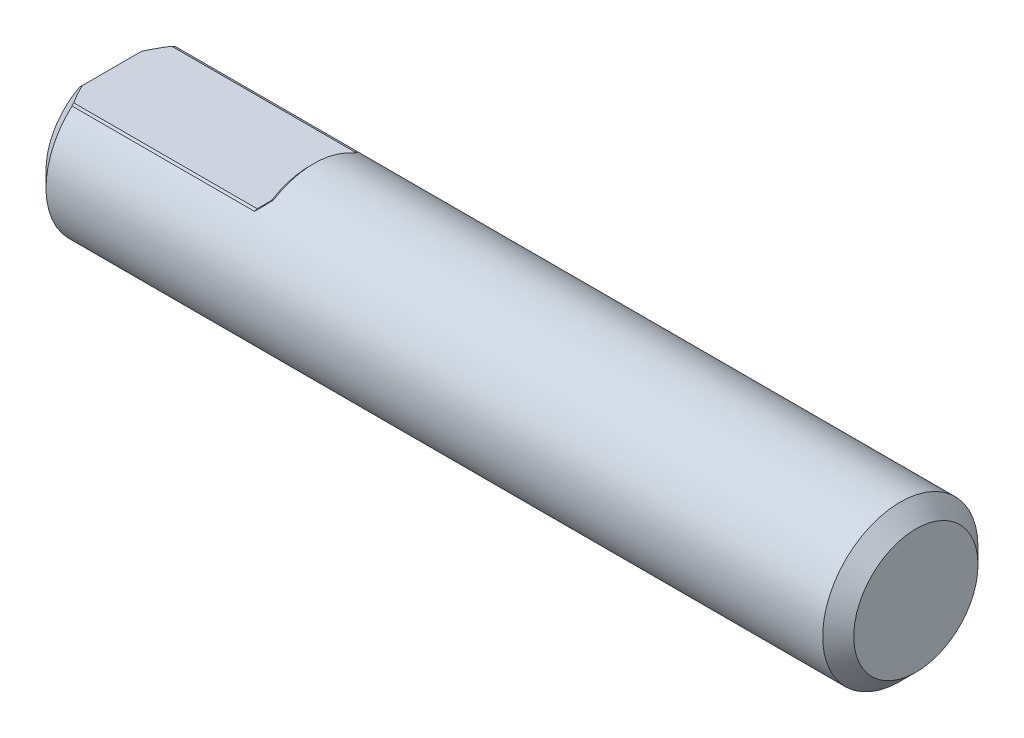
ISO-10303-21;
HEADER;
FILE_DESCRIPTION(('STEP AP214'),'2;1');
FILE_NAME('part.step','',(''),(''),'','','');
FILE_SCHEMA(('AUTOMOTIVE_DESIGN { 1 0 10303 214 1 1 1 1 }'));
ENDSEC;
DATA;
#1=APPLICATION_CONTEXT('core data for automotive mechanical design processes');
#2=APPLICATION_PROTOCOL_DEFINITION('international standard','automotive_design',2000,#1);
#3=PRODUCT_CONTEXT('',#1,'mechanical');
#4=PRODUCT('Part','Part','',(#3));
#5=PRODUCT_RELATED_PRODUCT_CATEGORY('part','',(#4));
#6=PRODUCT_DEFINITION_FORMATION('','',#4);
#7=PRODUCT_DEFINITION_CONTEXT('part definition',#1,'design');
#8=PRODUCT_DEFINITION('design','',#6,#7);
#9=PRODUCT_DEFINITION_SHAPE('','',#8);
#10=(LENGTH_UNIT() NAMED_UNIT(*) SI_UNIT(.MILLI.,.METRE.));
#11=(NAMED_UNIT(*) PLANE_ANGLE_UNIT() SI_UNIT($,.RADIAN.));
#12=(NAMED_UNIT(*) SI_UNIT($,.STERADIAN.) SOLID_ANGLE_UNIT());
#13=UNCERTAINTY_MEASURE_WITH_UNIT(LENGTH_MEASURE(1.E-05),#10,'distance_accuracy_value','');
#14=(GEOMETRIC_REPRESENTATION_CONTEXT(3) GLOBAL_UNCERTAINTY_ASSIGNED_CONTEXT((#13)) GLOBAL_UNIT_ASSIGNED_CONTEXT((#10,
#11,#12)) REPRESENTATION_CONTEXT('',''));
#15=CARTESIAN_POINT('',(0.,0.,0.));
#16=DIRECTION('',(0.,0.,1.));
#17=DIRECTION('',(1.,0.,0.));
#18=AXIS2_PLACEMENT_3D('',#15,#16,#17);
#19=CARTESIAN_POINT('',(-16.51,0.,0.));
#20=DIRECTION('',(1.,0.,0.));
#21=DIRECTION('',(0.,0.,-1.));
#22=AXIS2_PLACEMENT_3D('',#19,#20,#21);
#23=CYLINDRICAL_SURFACE('',#22,3.175);
#24=CARTESIAN_POINT('',(-8.09625,0.,0.));
#25=DIRECTION('',(1.,0.,0.));
#26=DIRECTION('',(0.,0.,-1.));
#27=AXIS2_PLACEMENT_3D('',#24,#25,#26);
#28=CIRCLE('',#27,3.175);
#29=CARTESIAN_POINT('',(-8.09625,2.70710526315788,-1.65897742425353));
#30=VERTEX_POINT('',#29);
#31=CARTESIAN_POINT('',(-8.09625,2.70710526315788,1.65897742425353));
#32=VERTEX_POINT('',#31);
#33=EDGE_CURVE('E223',#30,#32,#28,.T.);
#34=ORIENTED_EDGE('',*,*,#33,.T.);
#35=CARTESIAN_POINT('',(-8.41375,2.37289473684211,2.10950126045637));
#36=CARTESIAN_POINT('',(-8.40654883142077,2.37939133581361,2.10219436777673));
#37=CARTESIAN_POINT('',(-8.3995468585278,2.38594686327571,2.09475152028486));
#38=CARTESIAN_POINT('',(-8.38583125740677,2.39911418986797,2.0796575059484));
#39=CARTESIAN_POINT('',(-8.37911754596592,2.40572597208963,2.07200640027828));
#40=CARTESIAN_POINT('',(-8.36586675604192,2.41894568355362,2.05655792826817));
#41=CARTESIAN_POINT('',(-8.35932961470977,2.42555361332543,2.04876061568953));
#42=CARTESIAN_POINT('',(-8.34639596368614,2.43875105572825,2.03303311827344));
#43=CARTESIAN_POINT('',(-8.33999946833513,2.44534056642197,2.02510292003071));
#44=CARTESIAN_POINT('',(-8.31194823674003,2.47441587435366,1.98975995218611));
#45=CARTESIAN_POINT('',(-8.29089148155571,2.49671620615055,1.96171699625464));
#46=CARTESIAN_POINT('',(-8.24971643726588,2.54067493184155,1.90444266485578));
#47=CARTESIAN_POINT('',(-8.22959858993212,2.56233302183713,1.87521074182747));
#48=CARTESIAN_POINT('',(-8.19009663849421,2.60502765075115,1.81543740281639));
#49=CARTESIAN_POINT('',(-8.17071819429206,2.62605919769476,1.78488867234946));
#50=CARTESIAN_POINT('',(-8.13283630517575,2.66725118394069,1.72272664315219));
#51=CARTESIAN_POINT('',(-8.11433216102848,2.68741231821436,1.69111423098906));
#52=CARTESIAN_POINT('',(-8.09625,2.70710526315788,1.65897742425353));
#53=B_SPLINE_CURVE_WITH_KNOTS('',3,(#35,#36,#37,#38,#39,#40,#41,#42,#43,#44,#45,#46,#47,#48,#49,
#50,#51,#52),.UNSPECIFIED.,.F.,.F.,(4,2,2,2,2,2,2,2,4),(0.,0.0364197877296663,
0.0728289904434511,0.109225058031373,0.145624819565115,0.27025663971004,0.394946521888924,
0.520451969551505,0.645855282002147),.UNSPECIFIED.);
#54=CARTESIAN_POINT('',(-8.41375,2.37289473684211,2.10950126045637));
#55=VERTEX_POINT('',#54);
#56=EDGE_CURVE('E11',#32,#55,#53,.F.);
#57=ORIENTED_EDGE('',*,*,#56,.T.);
#58=DIRECTION('',(1.,0.,0.));
#59=VECTOR('',#58,1.);
#60=CARTESIAN_POINT('',(-16.51,2.37289473684211,2.10950126045637));
#61=LINE('',#60,#59);
#62=CARTESIAN_POINT('',(-15.875,2.37289473684211,2.10950126045637));
#63=VERTEX_POINT('',#62);
#64=EDGE_CURVE('E225',#55,#63,#61,.F.);
#65=ORIENTED_EDGE('',*,*,#64,.T.);
#66=CARTESIAN_POINT('',(-15.875,0.,0.));
#67=DIRECTION('',(1.,0.,0.));
#68=DIRECTION('',(0.,0.,-1.));
#69=AXIS2_PLACEMENT_3D('',#66,#67,#68);
#70=CIRCLE('',#69,3.175);
#71=CARTESIAN_POINT('',(-15.875,2.37289473684211,-2.10950126045637));
#72=VERTEX_POINT('',#71);
#73=EDGE_CURVE('E303',#63,#72,#70,.T.);
#74=ORIENTED_EDGE('',*,*,#73,.T.);
#75=DIRECTION('',(1.,0.,0.));
#76=VECTOR('',#75,1.);
#77=CARTESIAN_POINT('',(-16.51,2.37289473684211,-2.10950126045637));
#78=LINE('',#77,#76);
#79=CARTESIAN_POINT('',(-8.41375,2.37289473684211,-2.10950126045637));
#80=VERTEX_POINT('',#79);
#81=EDGE_CURVE('E108',#72,#80,#78,.T.);
#82=ORIENTED_EDGE('',*,*,#81,.T.);
#83=CARTESIAN_POINT('',(-8.09625,2.70710526315788,-1.65897742425353));
#84=CARTESIAN_POINT('',(-8.11244299617082,2.6894664866257,-1.68776138597786));
#85=CARTESIAN_POINT('',(-8.12897730513116,2.67145323789056,-1.71612372062465));
#86=CARTESIAN_POINT('',(-8.16274013808771,2.63472897983023,-1.77198898852324));
#87=CARTESIAN_POINT('',(-8.17996891925469,2.61601771221565,-1.79949159658917));
#88=CARTESIAN_POINT('',(-8.2139692366353,2.57920792901489,-1.8518280536098));
#89=CARTESIAN_POINT('',(-8.23069683238955,2.56114952785816,-1.87671872659557));
#90=CARTESIAN_POINT('',(-8.26479293330537,2.52454339796387,-1.92567886762807));
#91=CARTESIAN_POINT('',(-8.28216129431314,2.50599577955059,-1.94974851806443));
#92=CARTESIAN_POINT('',(-8.30883624575189,2.47782610959511,-1.98525387074256));
#93=CARTESIAN_POINT('',(-8.31785790058832,2.4683510241665,-1.9970213916408));
#94=CARTESIAN_POINT('',(-8.33612983270966,2.44932435157656,-2.02031216419312));
#95=CARTESIAN_POINT('',(-8.34538008488487,2.43977277289464,-2.03183544241939));
#96=CARTESIAN_POINT('',(-8.36417929059688,2.42062341091444,-2.05461153952933));
#97=CARTESIAN_POINT('',(-8.37372838725071,2.4110256073998,-2.06586422411867));
#98=CARTESIAN_POINT('',(-8.38839137064376,2.39665872958211,-2.0824758058195));
#99=CARTESIAN_POINT('',(-8.39333647054214,2.3918739187022,-2.08796935012561));
#100=CARTESIAN_POINT('',(-8.40339924447732,2.3823453872661,-2.09883492266498));
#101=CARTESIAN_POINT('',(-8.4085169515627,2.37760167479994,-2.10420692729465));
#102=CARTESIAN_POINT('',(-8.41375,2.37289473684211,-2.10950126045637));
#103=B_SPLINE_CURVE_WITH_KNOTS('',3,(#83,#84,#85,#86,#87,#88,#89,#90,#91,#92,#93,#94,#95,#96,
#97,#98,#99,#100,#101,#102),.UNSPECIFIED.,.F.,.F.,(4,2,2,2,2,2,2,2,2,4),(0.,0.112318328160042,
0.224678638186751,0.329680957283371,0.43465979622021,0.487447113191025,0.540228657420291,
0.593035877720582,0.61944860232403,0.645866413125716),.UNSPECIFIED.);
#104=EDGE_CURVE('E46',#80,#30,#103,.F.);
#105=ORIENTED_EDGE('',*,*,#104,.T.);
#106=EDGE_LOOP('',(#34,#57,#65,#74,#82,#105));
#107=FACE_BOUND('',#106,.T.);
#108=CARTESIAN_POINT('',(15.875,0.,0.));
#109=DIRECTION('',(1.,0.,0.));
#110=DIRECTION('',(0.,0.,-1.));
#111=AXIS2_PLACEMENT_3D('',#108,#109,#110);
#112=CIRCLE('',#111,3.175);
#113=CARTESIAN_POINT('',(15.875,0.,-3.175));
#114=VERTEX_POINT('',#113);
#115=EDGE_CURVE('E306',#114,#114,#112,.F.);
#116=ORIENTED_EDGE('',*,*,#115,.T.);
#117=EDGE_LOOP('',(#116));
#118=FACE_BOUND('',#117,.T.);
#119=ADVANCED_FACE('F35',(#107,#118),#23,.T.);
#120=CARTESIAN_POINT('',(-16.51,0.,0.));
#121=DIRECTION('',(1.,0.,0.));
#122=DIRECTION('',(0.,0.,-1.));
#123=AXIS2_PLACEMENT_3D('',#120,#121,#122);
#124=PLANE('',#123);
#125=CARTESIAN_POINT('',(-16.51,0.,0.));
#126=DIRECTION('',(1.,0.,0.));
#127=DIRECTION('',(0.,0.,-1.));
#128=AXIS2_PLACEMENT_3D('',#125,#126,#127);
#129=CIRCLE('',#128,2.54);
#130=CARTESIAN_POINT('',(-16.51,2.25425,-1.17045159553909));
#131=VERTEX_POINT('',#130);
#132=CARTESIAN_POINT('',(-16.51,2.25425,1.17045159553909));
#133=VERTEX_POINT('',#132);
#134=EDGE_CURVE('E136',#131,#133,#129,.F.);
#135=ORIENTED_EDGE('',*,*,#134,.T.);
#136=DIRECTION('',(0.,0.,-1.));
#137=VECTOR('',#136,1.);
#138=CARTESIAN_POINT('',(-16.51,2.25425,0.));
#139=LINE('',#138,#137);
#140=EDGE_CURVE('E221',#133,#131,#139,.T.);
#141=ORIENTED_EDGE('',*,*,#140,.T.);
#142=EDGE_LOOP('',(#135,#141));
#143=FACE_BOUND('',#142,.T.);
#144=ADVANCED_FACE('F158',(#143),#124,.F.);
#145=CARTESIAN_POINT('',(16.51,0.,0.));
#146=DIRECTION('',(1.,0.,0.));
#147=DIRECTION('',(0.,0.,-1.));
#148=AXIS2_PLACEMENT_3D('',#145,#146,#147);
#149=PLANE('',#148);
#150=CARTESIAN_POINT('',(16.51,0.,0.));
#151=DIRECTION('',(1.,0.,0.));
#152=DIRECTION('',(0.,0.,-1.));
#153=AXIS2_PLACEMENT_3D('',#150,#151,#152);
#154=CIRCLE('',#153,2.54);
#155=CARTESIAN_POINT('',(16.51,0.,-2.54));
#156=VERTEX_POINT('',#155);
#157=EDGE_CURVE('E301',#156,#156,#154,.T.);
#158=ORIENTED_EDGE('',*,*,#157,.T.);
#159=EDGE_LOOP('',(#158));
#160=FACE_BOUND('',#159,.T.);
#161=ADVANCED_FACE('F154',(#160),#149,.T.);
#162=CARTESIAN_POINT('',(16.51,0.,0.));
#163=DIRECTION('',(-1.,0.,0.));
#164=DIRECTION('',(0.,0.,1.));
#165=AXIS2_PLACEMENT_3D('',#162,#163,#164);
#166=CONICAL_SURFACE('',#165,2.54,0.78539816339745);
#167=ORIENTED_EDGE('',*,*,#115,.F.);
#168=EDGE_LOOP('',(#167));
#169=FACE_BOUND('',#168,.T.);
#170=ORIENTED_EDGE('',*,*,#157,.F.);
#171=EDGE_LOOP('',(#170));
#172=FACE_BOUND('',#171,.T.);
#173=ADVANCED_FACE('F157',(#169,#172),#166,.T.);
#174=CARTESIAN_POINT('',(-15.875,0.,0.));
#175=DIRECTION('',(1.,0.,0.));
#176=DIRECTION('',(0.,0.,-1.));
#177=AXIS2_PLACEMENT_3D('',#174,#175,#176);
#178=CONICAL_SURFACE('',#177,3.175,0.78539816339745);
#179=CARTESIAN_POINT('',(-13.882911020803,2.413,-4.56905236552823));
#180=CARTESIAN_POINT('',(-14.0010130257504,2.413,-4.43544487384208));
#181=CARTESIAN_POINT('',(-14.1185303164975,2.413,-4.3013109403701));
#182=CARTESIAN_POINT('',(-14.3519725656401,2.413,-4.03157204416195));
#183=CARTESIAN_POINT('',(-14.4678968667445,2.413,-3.89596651321785));
#184=CARTESIAN_POINT('',(-14.6994259205369,2.413,-3.62084444180082));
#185=CARTESIAN_POINT('',(-14.8149975048426,2.413,-3.48129988827945));
#186=CARTESIAN_POINT('',(-15.0431635676017,2.413,-3.19984020252248));
#187=CARTESIAN_POINT('',(-15.1557587057314,2.413,-3.05792560713694));
#188=CARTESIAN_POINT('',(-15.3733412175965,2.413,-2.77544902008223));
#189=CARTESIAN_POINT('',(-15.4784565842885,2.413,-2.63498631885226));
#190=CARTESIAN_POINT('',(-15.6832348518636,2.413,-2.34997604379301));
#191=CARTESIAN_POINT('',(-15.7828941009001,2.413,-2.20542582995128));
#192=CARTESIAN_POINT('',(-15.9736357185448,2.413,-1.91153149820139));
#193=CARTESIAN_POINT('',(-16.0647531375131,2.413,-1.76221067656942));
#194=CARTESIAN_POINT('',(-16.1918964912274,2.413,-1.53302902559399));
#195=CARTESIAN_POINT('',(-16.23267037574,2.413,-1.45580926348442));
#196=CARTESIAN_POINT('',(-16.3102228479336,2.413,-1.29939666679386));
#197=CARTESIAN_POINT('',(-16.3470025952556,2.413,-1.22020441315099));
#198=CARTESIAN_POINT('',(-16.4132401213838,2.413,-1.06513078546832));
#199=CARTESIAN_POINT('',(-16.4430257851112,2.413,-0.989390651623295));
#200=CARTESIAN_POINT('',(-16.4972879083901,2.413,-0.836009792743197));
#201=CARTESIAN_POINT('',(-16.5217644868105,2.413,-0.758369110304251));
#202=CARTESIAN_POINT('',(-16.5642367036986,2.413,-0.601744224137729));
#203=CARTESIAN_POINT('',(-16.5822655135757,2.413,-0.522769151892206));
#204=CARTESIAN_POINT('',(-16.6110286466182,2.413,-0.363507444205289));
#205=CARTESIAN_POINT('',(-16.6217655883898,2.413,-0.283221290208566));
#206=CARTESIAN_POINT('',(-16.6353331553132,2.413,-0.121027793503764));
#207=CARTESIAN_POINT('',(-16.6380703269761,2.413,-0.039112457163685));
#208=CARTESIAN_POINT('',(-16.6351731640611,2.413,0.124566519925082));
#209=CARTESIAN_POINT('',(-16.6295387980783,2.413,0.206330160103544));
#210=CARTESIAN_POINT('',(-16.610263967838,2.413,0.36920549629925));
#211=CARTESIAN_POINT('',(-16.5965931794655,2.413,0.45031353709131));
#212=CARTESIAN_POINT('',(-16.5620892154246,2.413,0.61097986208885));
#213=CARTESIAN_POINT('',(-16.5412543193735,2.413,0.69053776919311));
#214=CARTESIAN_POINT('',(-16.4828145822719,2.413,0.882970690766129));
#215=CARTESIAN_POINT('',(-16.4418772727662,2.413,0.994827915438709));
#216=CARTESIAN_POINT('',(-16.3504315525724,2.413,1.21454069398722));
#217=CARTESIAN_POINT('',(-16.2999160295463,2.413,1.32239320252352));
#218=CARTESIAN_POINT('',(-16.1914194845334,2.413,1.53537548009735));
#219=CARTESIAN_POINT('',(-16.1333790932668,2.413,1.64047461474305));
#220=CARTESIAN_POINT('',(-16.0120854291685,2.413,1.84753581600795));
#221=CARTESIAN_POINT('',(-15.9488339694613,2.413,1.94949895694012));
#222=CARTESIAN_POINT('',(-15.8090321968648,2.413,2.16541408062708));
#223=CARTESIAN_POINT('',(-15.7318796923937,2.413,2.27897370099984));
#224=CARTESIAN_POINT('',(-15.5738474150016,2.413,2.50348049537441));
#225=CARTESIAN_POINT('',(-15.4929669497232,2.413,2.61442717827304));
#226=CARTESIAN_POINT('',(-15.3283391364363,2.413,2.83434415915617));
#227=CARTESIAN_POINT('',(-15.2445888942529,2.413,2.9433122816209));
#228=CARTESIAN_POINT('',(-15.0749538347185,2.413,3.1595755058985));
#229=CARTESIAN_POINT('',(-14.989068932332,2.413,3.26687054078486));
#230=CARTESIAN_POINT('',(-14.8196183046048,2.413,3.47520627554137));
#231=CARTESIAN_POINT('',(-14.7361272668167,2.413,3.57630787334523));
#232=CARTESIAN_POINT('',(-14.5679255192931,2.413,3.77749463895693));
#233=CARTESIAN_POINT('',(-14.4832147754396,2.413,3.87757977819794));
#234=CARTESIAN_POINT('',(-14.3130312387801,2.413,4.07663685299898));
#235=CARTESIAN_POINT('',(-14.2275610825908,2.413,4.17561104638691));
#236=CARTESIAN_POINT('',(-14.0558069257072,2.413,4.37283838421592));
#237=CARTESIAN_POINT('',(-13.9695229850781,2.413,4.47109158093646));
#238=CARTESIAN_POINT('',(-13.882911020803,2.413,4.56905236552823));
#239=B_SPLINE_CURVE_WITH_KNOTS('',3,(#179,#180,#181,#182,#183,#184,#185,#186,#187,#188,#189,
#190,#191,#192,#193,#194,#195,#196,#197,#198,#199,#200,#201,#202,#203,#204,#205,#206,#207,#208,
#209,#210,#211,#212,#213,#214,#215,#216,#217,#218,#219,#220,#221,#222,#223,#224,#225,#226,#227,
#228,#229,#230,#231,#232,#233,#234,#235,#236,#237,#238),.UNSPECIFIED.,.F.,.F.,(4,2,2,2,2,2,2,2,
2,2,2,2,2,2,2,2,2,2,2,2,2,2,2,2,2,2,2,2,2,4),(0.,0.534977604919527,1.07016969429513,
1.61370698469222,2.15712278218338,2.68334365037696,3.20991252368626,3.73421629999166,
3.99610020276162,4.25790786682326,4.50190576651186,4.74589820258501,4.98861669045329,
5.23124796875132,5.47670255947556,5.72215807100121,5.96854576794942,6.21499267359869,
6.57169351548368,6.92866027161083,7.28863760707044,7.64849021774484,8.06025357872769,
8.47209372304441,8.88436219595295,9.29664711825714,9.68999375297357,10.0833514119939,
10.4756594372807,10.8679387295043),.UNSPECIFIED.);
#240=CARTESIAN_POINT('',(-16.3512500000078,2.413,1.20858701071037));
#241=VERTEX_POINT('',#240);
#242=CARTESIAN_POINT('',(-15.913331385052,2.413,2.00402619743356));
#243=VERTEX_POINT('',#242);
#244=EDGE_CURVE('E132',#241,#243,#239,.T.);
#245=ORIENTED_EDGE('',*,*,#244,.F.);
#246=CARTESIAN_POINT('',(-16.35125,2.413,1.20858701071037));
#247=CARTESIAN_POINT('',(-16.3777202254122,2.38652977458776,1.20233012883305));
#248=CARTESIAN_POINT('',(-16.4041845040834,2.36006549591659,1.19602373680136));
#249=CARTESIAN_POINT('',(-16.4571011707513,2.30714882924866,1.18331193175478));
#250=CARTESIAN_POINT('',(-16.4835535587468,2.28069644125317,1.17690651872937));
#251=CARTESIAN_POINT('',(-16.51,2.25425,1.1704515955391));
#252=B_SPLINE_CURVE_WITH_KNOTS('',3,(#246,#247,#248,#249,#250,#251),.UNSPECIFIED.,.F.,.F.,(4,2,
4),(0.,0.113861231526141,0.227722475135161),.UNSPECIFIED.);
#253=EDGE_CURVE('E215',#241,#133,#252,.T.);
#254=ORIENTED_EDGE('',*,*,#253,.T.);
#255=ORIENTED_EDGE('',*,*,#134,.F.);
#256=CARTESIAN_POINT('',(-16.51,2.25425,-1.17045159553909));
#257=CARTESIAN_POINT('',(-16.4835535587462,2.28069644125384,-1.17690651872662));
#258=CARTESIAN_POINT('',(-16.4571011707503,2.30714882924968,-1.18331193175211));
#259=CARTESIAN_POINT('',(-16.4041845040824,2.36006549591761,-1.19602373680451));
#260=CARTESIAN_POINT('',(-16.3777202254116,2.38652977458843,-1.20233012884194));
#261=CARTESIAN_POINT('',(-16.35125,2.413,-1.20858701072782));
#262=B_SPLINE_CURVE_WITH_KNOTS('',3,(#256,#257,#258,#259,#260,#261),.UNSPECIFIED.,.F.,.F.,(4,2,
4),(0.,0.113861243610483,0.227722475138062),.UNSPECIFIED.);
#263=CARTESIAN_POINT('',(-16.35125,2.413,-1.20858701072782));
#264=VERTEX_POINT('',#263);
#265=EDGE_CURVE('E113',#131,#264,#262,.T.);
#266=ORIENTED_EDGE('',*,*,#265,.T.);
#267=CARTESIAN_POINT('',(-15.913331385052,2.413,-2.00402619743355));
#268=VERTEX_POINT('',#267);
#269=EDGE_CURVE('E120',#268,#264,#239,.T.);
#270=ORIENTED_EDGE('',*,*,#269,.F.);
#271=CARTESIAN_POINT('',(-15.913331385052,2.413,-2.00402619743355));
#272=CARTESIAN_POINT('',(-15.9072095033889,2.40628359094504,-2.02169005530602));
#273=CARTESIAN_POINT('',(-15.9009542794537,2.39958328013893,-2.03931157549813));
#274=CARTESIAN_POINT('',(-15.8881771509402,2.38621485910596,-2.07446992978736));
#275=CARTESIAN_POINT('',(-15.8816552465247,2.37954674885944,-2.0920067639362));
#276=CARTESIAN_POINT('',(-15.875,2.37289473684211,-2.10950126045637));
#277=B_SPLINE_CURVE_WITH_KNOTS('',3,(#271,#272,#273,#274,#275,#276),.UNSPECIFIED.,.F.,.F.,(4,2,
4),(0.,0.059589090338114,0.119178144289784),.UNSPECIFIED.);
#278=EDGE_CURVE('E103',#268,#72,#277,.T.);
#279=ORIENTED_EDGE('',*,*,#278,.T.);
#280=ORIENTED_EDGE('',*,*,#73,.F.);
#281=CARTESIAN_POINT('',(-15.875,2.37289473684211,2.10950126045637));
#282=CARTESIAN_POINT('',(-15.8816552465247,2.37954674885944,2.0920067639362));
#283=CARTESIAN_POINT('',(-15.8881771509402,2.38621485910596,2.07446992978736));
#284=CARTESIAN_POINT('',(-15.9009542794537,2.39958328013893,2.03931157549813));
#285=CARTESIAN_POINT('',(-15.9072095033889,2.40628359094504,2.02169005530603));
#286=CARTESIAN_POINT('',(-15.913331385052,2.413,2.00402619743356));
#287=B_SPLINE_CURVE_WITH_KNOTS('',3,(#281,#282,#283,#284,#285,#286),.UNSPECIFIED.,.F.,.F.,(4,2,
4),(0.,0.0595890539516693,0.119178144289783),.UNSPECIFIED.);
#288=EDGE_CURVE('E114',#63,#243,#287,.T.);
#289=ORIENTED_EDGE('',*,*,#288,.T.);
#290=EDGE_LOOP('',(#245,#254,#255,#266,#270,#279,#280,#289));
#291=FACE_BOUND('',#290,.T.);
#292=ADVANCED_FACE('F129',(#291),#178,.T.);
#293=CARTESIAN_POINT('',(-8.255,2.413,-2.06350575477753));
#294=DIRECTION('',(0.,-1.,0.));
#295=DIRECTION('',(0.,0.,-1.));
#296=AXIS2_PLACEMENT_3D('',#293,#294,#295);
#297=PLANE('',#296);
#298=ORIENTED_EDGE('',*,*,#269,.T.);
#299=DIRECTION('',(0.,0.,1.));
#300=VECTOR('',#299,1.);
#301=CARTESIAN_POINT('',(-16.35125,2.413,-2.06350575477753));
#302=LINE('',#301,#300);
#303=EDGE_CURVE('E125',#264,#241,#302,.T.);
#304=ORIENTED_EDGE('',*,*,#303,.T.);
#305=ORIENTED_EDGE('',*,*,#244,.T.);
#306=DIRECTION('',(1.,0.,0.));
#307=VECTOR('',#306,1.);
#308=CARTESIAN_POINT('',(-8.255,2.413,2.00402619743355));
#309=LINE('',#308,#307);
#310=CARTESIAN_POINT('',(-8.41375,2.413,2.00402619743355));
#311=VERTEX_POINT('',#310);
#312=EDGE_CURVE('E126',#243,#311,#309,.T.);
#313=ORIENTED_EDGE('',*,*,#312,.T.);
#314=DIRECTION('',(0.,0.,-1.));
#315=VECTOR('',#314,1.);
#316=CARTESIAN_POINT('',(-8.41375,2.413,-2.06350575477753));
#317=LINE('',#316,#315);
#318=CARTESIAN_POINT('',(-8.41375,2.413,-2.00402619743355));
#319=VERTEX_POINT('',#318);
#320=EDGE_CURVE('E123',#311,#319,#317,.T.);
#321=ORIENTED_EDGE('',*,*,#320,.T.);
#322=DIRECTION('',(-1.,0.,0.));
#323=VECTOR('',#322,1.);
#324=CARTESIAN_POINT('',(-15.875,2.413,-2.00402619743355));
#325=LINE('',#324,#323);
#326=EDGE_CURVE('E107',#319,#268,#325,.T.);
#327=ORIENTED_EDGE('',*,*,#326,.T.);
#328=EDGE_LOOP('',(#298,#304,#305,#313,#321,#327));
#329=FACE_BOUND('',#328,.T.);
#330=ADVANCED_FACE('F118',(#329),#297,.F.);
#331=CARTESIAN_POINT('',(-8.255,0.,0.));
#332=DIRECTION('',(1.,0.,0.));
#333=DIRECTION('',(0.,0.,-1.));
#334=AXIS2_PLACEMENT_3D('',#331,#332,#333);
#335=PLANE('',#334);
#336=CARTESIAN_POINT('',(-8.255,0.,0.));
#337=DIRECTION('',(1.,0.,0.));
#338=DIRECTION('',(0.,0.,-1.));
#339=AXIS2_PLACEMENT_3D('',#336,#337,#338);
#340=CIRCLE('',#339,3.01625000000001);
#341=CARTESIAN_POINT('',(-8.255,2.57174999999999,1.57602855304086));
#342=VERTEX_POINT('',#341);
#343=CARTESIAN_POINT('',(-8.255,2.57174999999999,-1.57602855304086));
#344=VERTEX_POINT('',#343);
#345=EDGE_CURVE('E53',#342,#344,#340,.F.);
#346=ORIENTED_EDGE('',*,*,#345,.T.);
#347=DIRECTION('',(0.,0.,1.));
#348=VECTOR('',#347,1.);
#349=CARTESIAN_POINT('',(-8.255,2.57174999999999,2.06350575477753));
#350=LINE('',#349,#348);
#351=EDGE_CURVE('E228',#344,#342,#350,.T.);
#352=ORIENTED_EDGE('',*,*,#351,.T.);
#353=EDGE_LOOP('',(#346,#352));
#354=FACE_BOUND('',#353,.T.);
#355=ADVANCED_FACE('F153',(#354),#335,.F.);
#356=CARTESIAN_POINT('',(-16.35125,2.413,-2.06350575477753));
#357=DIRECTION('',(0.707106781186548,-0.707106781186548,0.));
#358=DIRECTION('',(0.,0.,1.));
#359=AXIS2_PLACEMENT_3D('',#356,#357,#358);
#360=PLANE('',#359);
#361=ORIENTED_EDGE('',*,*,#265,.F.);
#362=ORIENTED_EDGE('',*,*,#140,.F.);
#363=ORIENTED_EDGE('',*,*,#253,.F.);
#364=ORIENTED_EDGE('',*,*,#303,.F.);
#365=EDGE_LOOP('',(#361,#362,#363,#364));
#366=FACE_BOUND('',#365,.T.);
#367=ADVANCED_FACE('F193',(#366),#360,.F.);
#368=CARTESIAN_POINT('',(-16.51,2.37289473684211,2.10950126045637));
#369=DIRECTION('',(0.,0.93471076303118,0.355409326655435));
#370=DIRECTION('',(1.,0.,0.));
#371=AXIS2_PLACEMENT_3D('',#368,#369,#370);
#372=PLANE('',#371);
#373=ORIENTED_EDGE('',*,*,#288,.F.);
#374=ORIENTED_EDGE('',*,*,#64,.F.);
#375=DIRECTION('',(0.,-0.355409326655436,0.934710763031179));
#376=VECTOR('',#375,1.);
#377=CARTESIAN_POINT('',(-8.41375,2.413,2.00402619743355));
#378=LINE('',#377,#376);
#379=EDGE_CURVE('E41',#311,#55,#378,.T.);
#380=ORIENTED_EDGE('',*,*,#379,.F.);
#381=ORIENTED_EDGE('',*,*,#312,.F.);
#382=EDGE_LOOP('',(#373,#374,#380,#381));
#383=FACE_BOUND('',#382,.T.);
#384=ADVANCED_FACE('F38',(#383),#372,.T.);
#385=CARTESIAN_POINT('',(-8.41375,2.413,2.00402619743355));
#386=CARTESIAN_POINT('',(-8.255,2.57174999999999,1.57602855304086));
#387=CARTESIAN_POINT('',(-8.41375,2.37289473684211,2.10950126045637));
#388=CARTESIAN_POINT('',(-8.09625,2.70710526315788,1.65897742425353));
#389=CARTESIAN_POINT('',(-8.41375,2.36617225888692,2.12718107926722));
#390=CARTESIAN_POINT('',(-8.06964019142738,2.72979362625665,1.67288138383958));
#391=B_SPLINE_SURFACE_WITH_KNOTS('',1,1,((#385,#386),(#387,#388),(#389,#390)),.UNSPECIFIED.,.F.,
.F.,.F.,(2,1,2),(2,2),(0.,1.,1.16762084140236),(0.,1.),.UNSPECIFIED.);
#392=DIRECTION('',(-0.707106781186554,-0.602901571327469,-0.369472184732301));
#393=VECTOR('',#392,1.);
#394=CARTESIAN_POINT('',(-8.09625,2.70710526315788,1.65897742425353));
#395=LINE('',#394,#393);
#396=EDGE_CURVE('E239',#342,#32,#395,.F.);
#397=CARTESIAN_POINT('',(-8.255,2.57174999999999,1.57602855304086));
#398=CARTESIAN_POINT('',(-8.26822916666667,2.55852083333333,1.61169502340692));
#399=CARTESIAN_POINT('',(-8.28145833333333,2.54529166666666,1.64736149377298));
#400=CARTESIAN_POINT('',(-8.31453125,2.51221874999999,1.73652766968812));
#401=CARTESIAN_POINT('',(-8.334375,2.492375,1.79002737523721));
#402=CARTESIAN_POINT('',(-8.37406249999999,2.4526875,1.89702678633538));
#403=CARTESIAN_POINT('',(-8.39390624999999,2.43284375,1.95052649188447));
#404=CARTESIAN_POINT('',(-8.41375,2.413,2.00402619743355));
#405=B_SPLINE_CURVE_WITH_KNOTS('',3,(#397,#398,#399,#400,#401,#402,#403,#404),.UNSPECIFIED.,.F.,
.F.,(4,2,2,4),(0.,0.12082660836031,0.302066520900776,0.483306433441241),.UNSPECIFIED.);
#406=EDGE_CURVE('E242',#311,#342,#405,.F.);
#407=ORIENTED_EDGE('',*,*,#379,.T.);
#408=ORIENTED_EDGE('',*,*,#56,.F.);
#409=ORIENTED_EDGE('',*,*,#396,.F.);
#410=ORIENTED_EDGE('',*,*,#406,.F.);
#411=EDGE_LOOP('',(#407,#408,#409,#410));
#412=FACE_BOUND('',#411,.T.);
#413=ADVANCED_FACE('F280',(#412),#391,.T.);
#414=CARTESIAN_POINT('',(-8.255,0.,0.));
#415=DIRECTION('',(1.,0.,0.));
#416=DIRECTION('',(0.,0.,-1.));
#417=AXIS2_PLACEMENT_3D('',#414,#415,#416);
#418=CONICAL_SURFACE('',#417,3.01625000000001,0.78539816339744);
#419=ORIENTED_EDGE('',*,*,#396,.T.);
#420=ORIENTED_EDGE('',*,*,#33,.F.);
#421=DIRECTION('',(0.707106781186554,0.602901571327469,-0.369472184732301));
#422=VECTOR('',#421,1.);
#423=CARTESIAN_POINT('',(-8.255,2.57174999999999,-1.57602855304086));
#424=LINE('',#423,#422);
#425=EDGE_CURVE('E237',#344,#30,#424,.T.);
#426=ORIENTED_EDGE('',*,*,#425,.F.);
#427=ORIENTED_EDGE('',*,*,#345,.F.);
#428=EDGE_LOOP('',(#419,#420,#426,#427));
#429=FACE_BOUND('',#428,.T.);
#430=ADVANCED_FACE('F236',(#429),#418,.T.);
#431=CARTESIAN_POINT('',(-8.255,2.57174999999999,0.));
#432=DIRECTION('',(-0.707106781186542,0.707106781186553,0.));
#433=DIRECTION('',(0.,0.,-1.));
#434=AXIS2_PLACEMENT_3D('',#431,#432,#433);
#435=PLANE('',#434);
#436=ORIENTED_EDGE('',*,*,#406,.T.);
#437=ORIENTED_EDGE('',*,*,#351,.F.);
#438=CARTESIAN_POINT('',(-8.41375,2.413,-2.00402619743355));
#439=CARTESIAN_POINT('',(-8.40959805429358,2.41715194570641,-1.9928323518777));
#440=CARTESIAN_POINT('',(-8.40544610858717,2.42130389141283,-1.98163850632185));
#441=CARTESIAN_POINT('',(-8.3846863800551,2.4420636199449,-1.92566927854259));
#442=CARTESIAN_POINT('',(-8.36807859722944,2.45867140277055,-1.88089389631918));
#443=CARTESIAN_POINT('',(-8.33539234533649,2.49135765466351,-1.79277018725328));
#444=CARTESIAN_POINT('',(-8.31931387626919,2.5074361237308,-1.7494218604108));
#445=CARTESIAN_POINT('',(-8.2871569381346,2.5395930618654,-1.66272520672583));
#446=CARTESIAN_POINT('',(-8.2710784690673,2.5556715309327,-1.61937687988334));
#447=CARTESIAN_POINT('',(-8.255,2.57174999999999,-1.57602855304086));
#448=B_SPLINE_CURVE_WITH_KNOTS('',3,(#438,#439,#440,#441,#442,#443,#444,#445,#446,#447),
.UNSPECIFIED.,.F.,.F.,(4,2,2,2,4),(0.,0.0379211729992191,0.189605864996093,0.336456149218667,
0.483306433441241),.UNSPECIFIED.);
#449=EDGE_CURVE('E241',#319,#344,#448,.T.);
#450=ORIENTED_EDGE('',*,*,#449,.F.);
#451=ORIENTED_EDGE('',*,*,#320,.F.);
#452=EDGE_LOOP('',(#436,#437,#450,#451));
#453=FACE_BOUND('',#452,.T.);
#454=ADVANCED_FACE('F257',(#453),#435,.T.);
#455=CARTESIAN_POINT('',(-8.255,2.57174999999999,-1.57602855304086));
#456=CARTESIAN_POINT('',(-8.41375,2.413,-2.00402619743355));
#457=CARTESIAN_POINT('',(-8.09625,2.70710526315788,-1.65897742425353));
#458=CARTESIAN_POINT('',(-8.41375,2.37289473684211,-2.10950126045637));
#459=CARTESIAN_POINT('',(-8.06925751720794,2.73011990638058,-1.6730813359312));
#460=CARTESIAN_POINT('',(-8.41375,2.36607558329464,-2.12743533178635));
#461=B_SPLINE_SURFACE_WITH_KNOTS('',1,1,((#455,#456),(#457,#458),(#459,#460)),.UNSPECIFIED.,.F.,
.F.,.F.,(2,1,2),(2,2),(0.,1.,1.17003138766651),(0.,1.),.UNSPECIFIED.);
#462=DIRECTION('',(0.,0.355409326655436,0.934710763031179));
#463=VECTOR('',#462,1.);
#464=CARTESIAN_POINT('',(-8.41375,2.37289473684211,-2.10950126045637));
#465=LINE('',#464,#463);
#466=EDGE_CURVE('E179',#319,#80,#465,.F.);
#467=ORIENTED_EDGE('',*,*,#425,.T.);
#468=ORIENTED_EDGE('',*,*,#104,.F.);
#469=ORIENTED_EDGE('',*,*,#466,.F.);
#470=ORIENTED_EDGE('',*,*,#449,.T.);
#471=EDGE_LOOP('',(#467,#468,#469,#470));
#472=FACE_BOUND('',#471,.T.);
#473=ADVANCED_FACE('F240',(#472),#461,.T.);
#474=CARTESIAN_POINT('',(-16.51,2.413,-2.00402619743355));
#475=DIRECTION('',(0.,0.93471076303118,-0.355409326655435));
#476=DIRECTION('',(1.,0.,0.));
#477=AXIS2_PLACEMENT_3D('',#474,#475,#476);
#478=PLANE('',#477);
#479=ORIENTED_EDGE('',*,*,#466,.T.);
#480=ORIENTED_EDGE('',*,*,#81,.F.);
#481=ORIENTED_EDGE('',*,*,#278,.F.);
#482=ORIENTED_EDGE('',*,*,#326,.F.);
#483=EDGE_LOOP('',(#479,#480,#481,#482));
#484=FACE_BOUND('',#483,.T.);
#485=ADVANCED_FACE('F106',(#484),#478,.T.);
#486=CLOSED_SHELL('',(#119,#144,#161,#173,#292,#330,#355,#367,#384,#413,#430,#454,#473,#485));
#487=MANIFOLD_SOLID_BREP('B2',#486);
#488=ADVANCED_BREP_SHAPE_REPRESENTATION('',(#18,#487),#14);
#489=SHAPE_DEFINITION_REPRESENTATION(#9,#488);
ENDSEC;
END-ISO-10303-21;
